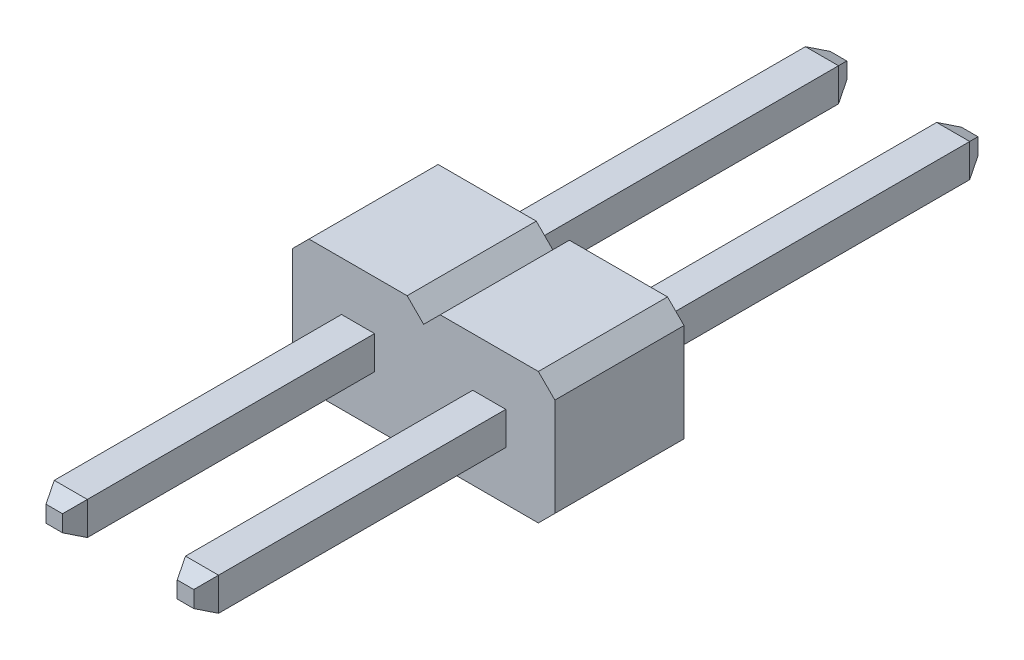
ISO-10303-21;
HEADER;
FILE_DESCRIPTION(('STEP AP214'),'2;1');
FILE_NAME('part.step','',(''),(''),'','','');
FILE_SCHEMA(('AUTOMOTIVE_DESIGN { 1 0 10303 214 1 1 1 1 }'));
ENDSEC;
DATA;
#1=APPLICATION_CONTEXT('core data for automotive mechanical design processes');
#2=APPLICATION_PROTOCOL_DEFINITION('international standard','automotive_design',2000,#1);
#3=PRODUCT_CONTEXT('',#1,'mechanical');
#4=PRODUCT('Part','Part','',(#3));
#5=PRODUCT_RELATED_PRODUCT_CATEGORY('part','',(#4));
#6=PRODUCT_DEFINITION_FORMATION('','',#4);
#7=PRODUCT_DEFINITION_CONTEXT('part definition',#1,'design');
#8=PRODUCT_DEFINITION('design','',#6,#7);
#9=PRODUCT_DEFINITION_SHAPE('','',#8);
#10=(LENGTH_UNIT() NAMED_UNIT(*) SI_UNIT(.MILLI.,.METRE.));
#11=(NAMED_UNIT(*) PLANE_ANGLE_UNIT() SI_UNIT($,.RADIAN.));
#12=(NAMED_UNIT(*) SI_UNIT($,.STERADIAN.) SOLID_ANGLE_UNIT());
#13=UNCERTAINTY_MEASURE_WITH_UNIT(LENGTH_MEASURE(1.E-05),#10,'distance_accuracy_value','');
#14=(GEOMETRIC_REPRESENTATION_CONTEXT(3) GLOBAL_UNCERTAINTY_ASSIGNED_CONTEXT((#13)) GLOBAL_UNIT_ASSIGNED_CONTEXT((#10,
#11,#12)) REPRESENTATION_CONTEXT('',''));
#15=CARTESIAN_POINT('',(0.,0.,0.));
#16=DIRECTION('',(0.,0.,1.));
#17=DIRECTION('',(1.,0.,0.));
#18=AXIS2_PLACEMENT_3D('',#15,#16,#17);
#19=CARTESIAN_POINT('',(0.32,0.,8.06));
#20=DIRECTION('',(-0.894427190999916,0.,-0.447213595499957));
#21=DIRECTION('',(-0.447213595499957,0.,0.894427190999916));
#22=AXIS2_PLACEMENT_3D('',#19,#20,#21);
#23=PLANE('',#22);
#24=DIRECTION('',(-0.408248290463863,-0.408248290463863,0.816496580927727));
#25=VECTOR('',#24,1.);
#26=CARTESIAN_POINT('',(0.266666666666667,0.266666666666667,8.16666666666667));
#27=LINE('',#26,#25);
#28=CARTESIAN_POINT('',(0.32,0.32,8.06));
#29=VERTEX_POINT('',#28);
#30=CARTESIAN_POINT('',(0.16,0.16,8.38));
#31=VERTEX_POINT('',#30);
#32=EDGE_CURVE('P0_E66',#29,#31,#27,.T.);
#33=ORIENTED_EDGE('',*,*,#32,.T.);
#34=DIRECTION('',(0.,1.,0.));
#35=VECTOR('',#34,1.);
#36=CARTESIAN_POINT('',(0.16,0.,8.38));
#37=LINE('',#36,#35);
#38=CARTESIAN_POINT('',(0.16,-0.16,8.38));
#39=VERTEX_POINT('',#38);
#40=EDGE_CURVE('P0_E110',#39,#31,#37,.T.);
#41=ORIENTED_EDGE('',*,*,#40,.F.);
#42=DIRECTION('',(0.408248290463863,-0.408248290463863,-0.816496580927727));
#43=VECTOR('',#42,1.);
#44=CARTESIAN_POINT('',(0.133333333333333,-0.133333333333333,8.43333333333333));
#45=LINE('',#44,#43);
#46=CARTESIAN_POINT('',(0.32,-0.32,8.06));
#47=VERTEX_POINT('',#46);
#48=EDGE_CURVE('P0_E12',#39,#47,#45,.T.);
#49=ORIENTED_EDGE('',*,*,#48,.T.);
#50=DIRECTION('',(0.,-1.,0.));
#51=VECTOR('',#50,1.);
#52=CARTESIAN_POINT('',(0.32,0.,8.06));
#53=LINE('',#52,#51);
#54=EDGE_CURVE('P0_E107',#29,#47,#53,.T.);
#55=ORIENTED_EDGE('',*,*,#54,.F.);
#56=EDGE_LOOP('',(#33,#41,#49,#55));
#57=FACE_BOUND('',#56,.T.);
#58=ADVANCED_FACE('P0_F55',(#57),#23,.F.);
#59=CARTESIAN_POINT('',(0.,-0.16,8.38));
#60=DIRECTION('',(0.,-0.894427190999916,0.447213595499957));
#61=DIRECTION('',(-1.,0.,0.));
#62=AXIS2_PLACEMENT_3D('',#59,#60,#61);
#63=PLANE('',#62);
#64=DIRECTION('',(-0.408248290463863,-0.408248290463863,-0.816496580927727));
#65=VECTOR('',#64,1.);
#66=CARTESIAN_POINT('',(-0.133333333333333,-0.133333333333333,8.43333333333333));
#67=LINE('',#66,#65);
#68=CARTESIAN_POINT('',(-0.16,-0.16,8.38));
#69=VERTEX_POINT('',#68);
#70=CARTESIAN_POINT('',(-0.32,-0.32,8.06));
#71=VERTEX_POINT('',#70);
#72=EDGE_CURVE('P0_E131',#69,#71,#67,.T.);
#73=ORIENTED_EDGE('',*,*,#72,.T.);
#74=DIRECTION('',(-1.,0.,0.));
#75=VECTOR('',#74,1.);
#76=CARTESIAN_POINT('',(-0.32,-0.32,8.06));
#77=LINE('',#76,#75);
#78=EDGE_CURVE('P0_E59',#47,#71,#77,.T.);
#79=ORIENTED_EDGE('',*,*,#78,.F.);
#80=ORIENTED_EDGE('',*,*,#48,.F.);
#81=DIRECTION('',(1.,0.,0.));
#82=VECTOR('',#81,1.);
#83=CARTESIAN_POINT('',(0.32,-0.16,8.38));
#84=LINE('',#83,#82);
#85=EDGE_CURVE('P0_E184',#69,#39,#84,.T.);
#86=ORIENTED_EDGE('',*,*,#85,.F.);
#87=EDGE_LOOP('',(#73,#79,#80,#86));
#88=FACE_BOUND('',#87,.T.);
#89=ADVANCED_FACE('P0_F130',(#88),#63,.T.);
#90=CARTESIAN_POINT('',(0.,0.32,8.06));
#91=DIRECTION('',(0.,-0.894427190999916,-0.447213595499957));
#92=DIRECTION('',(0.,0.447213595499957,-0.894427190999916));
#93=AXIS2_PLACEMENT_3D('',#90,#91,#92);
#94=PLANE('',#93);
#95=DIRECTION('',(0.408248290463863,-0.408248290463863,0.816496580927727));
#96=VECTOR('',#95,1.);
#97=CARTESIAN_POINT('',(-0.266666666666667,0.266666666666667,8.16666666666667));
#98=LINE('',#97,#96);
#99=CARTESIAN_POINT('',(-0.32,0.32,8.06));
#100=VERTEX_POINT('',#99);
#101=CARTESIAN_POINT('',(-0.16,0.16,8.38));
#102=VERTEX_POINT('',#101);
#103=EDGE_CURVE('P0_E102',#100,#102,#98,.T.);
#104=ORIENTED_EDGE('',*,*,#103,.T.);
#105=DIRECTION('',(-1.,0.,0.));
#106=VECTOR('',#105,1.);
#107=CARTESIAN_POINT('',(0.,0.16,8.38));
#108=LINE('',#107,#106);
#109=EDGE_CURVE('P0_E176',#31,#102,#108,.T.);
#110=ORIENTED_EDGE('',*,*,#109,.F.);
#111=ORIENTED_EDGE('',*,*,#32,.F.);
#112=DIRECTION('',(1.,0.,0.));
#113=VECTOR('',#112,1.);
#114=CARTESIAN_POINT('',(0.,0.32,8.06));
#115=LINE('',#114,#113);
#116=EDGE_CURVE('P0_E152',#100,#29,#115,.T.);
#117=ORIENTED_EDGE('',*,*,#116,.F.);
#118=EDGE_LOOP('',(#104,#110,#111,#117));
#119=FACE_BOUND('',#118,.T.);
#120=ADVANCED_FACE('P0_F291',(#119),#94,.F.);
#121=CARTESIAN_POINT('',(-0.16,0.,8.38));
#122=DIRECTION('',(-0.894427190999916,0.,0.447213595499957));
#123=DIRECTION('',(0.,1.,0.));
#124=AXIS2_PLACEMENT_3D('',#121,#122,#123);
#125=PLANE('',#124);
#126=ORIENTED_EDGE('',*,*,#72,.F.);
#127=DIRECTION('',(0.,-1.,0.));
#128=VECTOR('',#127,1.);
#129=CARTESIAN_POINT('',(-0.16,-0.32,8.38));
#130=LINE('',#129,#128);
#131=EDGE_CURVE('P0_E127',#102,#69,#130,.T.);
#132=ORIENTED_EDGE('',*,*,#131,.F.);
#133=ORIENTED_EDGE('',*,*,#103,.F.);
#134=DIRECTION('',(0.,1.,0.));
#135=VECTOR('',#134,1.);
#136=CARTESIAN_POINT('',(-0.32,0.32,8.06));
#137=LINE('',#136,#135);
#138=EDGE_CURVE('P0_E141',#71,#100,#137,.T.);
#139=ORIENTED_EDGE('',*,*,#138,.F.);
#140=EDGE_LOOP('',(#126,#132,#133,#139));
#141=FACE_BOUND('',#140,.T.);
#142=ADVANCED_FACE('P0_F293',(#141),#125,.T.);
#143=CARTESIAN_POINT('',(0.,0.,8.38));
#144=DIRECTION('',(0.,0.,1.));
#145=DIRECTION('',(1.,0.,0.));
#146=AXIS2_PLACEMENT_3D('',#143,#144,#145);
#147=PLANE('',#146);
#148=ORIENTED_EDGE('',*,*,#131,.T.);
#149=ORIENTED_EDGE('',*,*,#85,.T.);
#150=ORIENTED_EDGE('',*,*,#40,.T.);
#151=ORIENTED_EDGE('',*,*,#109,.T.);
#152=EDGE_LOOP('',(#148,#149,#150,#151));
#153=FACE_BOUND('',#152,.T.);
#154=ADVANCED_FACE('P0_F299',(#153),#147,.T.);
#155=CARTESIAN_POINT('',(0.32,0.,8.38));
#156=DIRECTION('',(1.,0.,0.));
#157=DIRECTION('',(0.,1.,0.));
#158=AXIS2_PLACEMENT_3D('',#155,#156,#157);
#159=PLANE('',#158);
#160=DIRECTION('',(0.,0.,-1.));
#161=VECTOR('',#160,1.);
#162=CARTESIAN_POINT('',(0.32,0.32,8.38));
#163=LINE('',#162,#161);
#164=CARTESIAN_POINT('',(0.32,0.32,-6.48));
#165=VERTEX_POINT('',#164);
#166=EDGE_CURVE('P0_E124',#29,#165,#163,.T.);
#167=ORIENTED_EDGE('',*,*,#166,.F.);
#168=ORIENTED_EDGE('',*,*,#54,.T.);
#169=DIRECTION('',(0.,0.,-1.));
#170=VECTOR('',#169,1.);
#171=CARTESIAN_POINT('',(0.32,-0.32,8.38));
#172=LINE('',#171,#170);
#173=CARTESIAN_POINT('',(0.32,-0.32,-6.48));
#174=VERTEX_POINT('',#173);
#175=EDGE_CURVE('P0_E121',#47,#174,#172,.T.);
#176=ORIENTED_EDGE('',*,*,#175,.T.);
#177=DIRECTION('',(0.,1.,0.));
#178=VECTOR('',#177,1.);
#179=CARTESIAN_POINT('',(0.32,0.,-6.48));
#180=LINE('',#179,#178);
#181=EDGE_CURVE('P0_E211',#174,#165,#180,.T.);
#182=ORIENTED_EDGE('',*,*,#181,.T.);
#183=EDGE_LOOP('',(#167,#168,#176,#182));
#184=FACE_BOUND('',#183,.T.);
#185=ADVANCED_FACE('P0_F117',(#184),#159,.T.);
#186=CARTESIAN_POINT('',(0.,-0.32,8.38));
#187=DIRECTION('',(0.,1.,0.));
#188=DIRECTION('',(1.,0.,0.));
#189=AXIS2_PLACEMENT_3D('',#186,#187,#188);
#190=PLANE('',#189);
#191=ORIENTED_EDGE('',*,*,#175,.F.);
#192=ORIENTED_EDGE('',*,*,#78,.T.);
#193=DIRECTION('',(0.,0.,-1.));
#194=VECTOR('',#193,1.);
#195=CARTESIAN_POINT('',(-0.32,-0.32,8.38));
#196=LINE('',#195,#194);
#197=CARTESIAN_POINT('',(-0.32,-0.32,-6.48));
#198=VERTEX_POINT('',#197);
#199=EDGE_CURVE('P0_E148',#71,#198,#196,.T.);
#200=ORIENTED_EDGE('',*,*,#199,.T.);
#201=DIRECTION('',(1.,0.,0.));
#202=VECTOR('',#201,1.);
#203=CARTESIAN_POINT('',(0.32,-0.32,-6.48));
#204=LINE('',#203,#202);
#205=EDGE_CURVE('P0_E139',#198,#174,#204,.T.);
#206=ORIENTED_EDGE('',*,*,#205,.T.);
#207=EDGE_LOOP('',(#191,#192,#200,#206));
#208=FACE_BOUND('',#207,.T.);
#209=ADVANCED_FACE('P0_F137',(#208),#190,.F.);
#210=CARTESIAN_POINT('',(-0.32,0.,8.38));
#211=DIRECTION('',(1.,0.,0.));
#212=DIRECTION('',(0.,1.,0.));
#213=AXIS2_PLACEMENT_3D('',#210,#211,#212);
#214=PLANE('',#213);
#215=ORIENTED_EDGE('',*,*,#199,.F.);
#216=ORIENTED_EDGE('',*,*,#138,.T.);
#217=DIRECTION('',(0.,0.,-1.));
#218=VECTOR('',#217,1.);
#219=CARTESIAN_POINT('',(-0.32,0.32,8.38));
#220=LINE('',#219,#218);
#221=CARTESIAN_POINT('',(-0.32,0.32,-6.48));
#222=VERTEX_POINT('',#221);
#223=EDGE_CURVE('P0_E162',#100,#222,#220,.T.);
#224=ORIENTED_EDGE('',*,*,#223,.T.);
#225=DIRECTION('',(0.,-1.,0.));
#226=VECTOR('',#225,1.);
#227=CARTESIAN_POINT('',(-0.32,-0.32,-6.48));
#228=LINE('',#227,#226);
#229=EDGE_CURVE('P0_E197',#222,#198,#228,.T.);
#230=ORIENTED_EDGE('',*,*,#229,.T.);
#231=EDGE_LOOP('',(#215,#216,#224,#230));
#232=FACE_BOUND('',#231,.T.);
#233=ADVANCED_FACE('P0_F290',(#232),#214,.F.);
#234=CARTESIAN_POINT('',(0.,0.32,8.38));
#235=DIRECTION('',(0.,1.,0.));
#236=DIRECTION('',(1.,0.,0.));
#237=AXIS2_PLACEMENT_3D('',#234,#235,#236);
#238=PLANE('',#237);
#239=ORIENTED_EDGE('',*,*,#223,.F.);
#240=ORIENTED_EDGE('',*,*,#116,.T.);
#241=ORIENTED_EDGE('',*,*,#166,.T.);
#242=DIRECTION('',(-1.,0.,0.));
#243=VECTOR('',#242,1.);
#244=CARTESIAN_POINT('',(0.,0.32,-6.48));
#245=LINE('',#244,#243);
#246=EDGE_CURVE('P0_E201',#165,#222,#245,.T.);
#247=ORIENTED_EDGE('',*,*,#246,.T.);
#248=EDGE_LOOP('',(#239,#240,#241,#247));
#249=FACE_BOUND('',#248,.T.);
#250=ADVANCED_FACE('P0_F57',(#249),#238,.T.);
#251=CARTESIAN_POINT('',(0.16,0.,-6.8));
#252=DIRECTION('',(-0.894427190999916,0.,0.447213595499958));
#253=DIRECTION('',(0.,1.,0.));
#254=AXIS2_PLACEMENT_3D('',#251,#252,#253);
#255=PLANE('',#254);
#256=DIRECTION('',(0.408248290463863,0.408248290463863,0.816496580927726));
#257=VECTOR('',#256,1.);
#258=CARTESIAN_POINT('',(0.133333333333333,0.133333333333333,-6.85333333333333));
#259=LINE('',#258,#257);
#260=CARTESIAN_POINT('',(0.16,0.16,-6.8));
#261=VERTEX_POINT('',#260);
#262=EDGE_CURVE('P0_E217',#261,#165,#259,.T.);
#263=ORIENTED_EDGE('',*,*,#262,.T.);
#264=ORIENTED_EDGE('',*,*,#181,.F.);
#265=DIRECTION('',(-0.408248290463863,0.408248290463863,-0.816496580927726));
#266=VECTOR('',#265,1.);
#267=CARTESIAN_POINT('',(0.266666666666666,-0.266666666666666,-6.58666666666667));
#268=LINE('',#267,#266);
#269=CARTESIAN_POINT('',(0.16,-0.16,-6.8));
#270=VERTEX_POINT('',#269);
#271=EDGE_CURVE('P0_E169',#174,#270,#268,.T.);
#272=ORIENTED_EDGE('',*,*,#271,.T.);
#273=DIRECTION('',(0.,-1.,0.));
#274=VECTOR('',#273,1.);
#275=CARTESIAN_POINT('',(0.16,0.,-6.8));
#276=LINE('',#275,#274);
#277=EDGE_CURVE('P0_E196',#261,#270,#276,.T.);
#278=ORIENTED_EDGE('',*,*,#277,.F.);
#279=EDGE_LOOP('',(#263,#264,#272,#278));
#280=FACE_BOUND('',#279,.T.);
#281=ADVANCED_FACE('P0_F283',(#280),#255,.F.);
#282=CARTESIAN_POINT('',(0.,-0.32,-6.48));
#283=DIRECTION('',(0.,-0.894427190999916,-0.447213595499958));
#284=DIRECTION('',(0.,0.447213595499958,-0.894427190999916));
#285=AXIS2_PLACEMENT_3D('',#282,#283,#284);
#286=PLANE('',#285);
#287=DIRECTION('',(0.408248290463863,0.408248290463863,-0.816496580927726));
#288=VECTOR('',#287,1.);
#289=CARTESIAN_POINT('',(-0.266666666666666,-0.266666666666666,-6.58666666666667));
#290=LINE('',#289,#288);
#291=CARTESIAN_POINT('',(-0.16,-0.16,-6.8));
#292=VERTEX_POINT('',#291);
#293=EDGE_CURVE('P0_E202',#198,#292,#290,.T.);
#294=ORIENTED_EDGE('',*,*,#293,.T.);
#295=DIRECTION('',(-1.,0.,0.));
#296=VECTOR('',#295,1.);
#297=CARTESIAN_POINT('',(-0.32,-0.16,-6.8));
#298=LINE('',#297,#296);
#299=EDGE_CURVE('P0_E191',#270,#292,#298,.T.);
#300=ORIENTED_EDGE('',*,*,#299,.F.);
#301=ORIENTED_EDGE('',*,*,#271,.F.);
#302=ORIENTED_EDGE('',*,*,#205,.F.);
#303=EDGE_LOOP('',(#294,#300,#301,#302));
#304=FACE_BOUND('',#303,.T.);
#305=ADVANCED_FACE('P0_F285',(#304),#286,.T.);
#306=CARTESIAN_POINT('',(0.,0.16,-6.8));
#307=DIRECTION('',(0.,-0.894427190999916,0.447213595499958));
#308=DIRECTION('',(-1.,0.,0.));
#309=AXIS2_PLACEMENT_3D('',#306,#307,#308);
#310=PLANE('',#309);
#311=DIRECTION('',(-0.408248290463863,0.408248290463863,0.816496580927726));
#312=VECTOR('',#311,1.);
#313=CARTESIAN_POINT('',(-0.133333333333333,0.133333333333333,-6.85333333333333));
#314=LINE('',#313,#312);
#315=CARTESIAN_POINT('',(-0.16,0.16,-6.8));
#316=VERTEX_POINT('',#315);
#317=EDGE_CURVE('P0_E206',#316,#222,#314,.T.);
#318=ORIENTED_EDGE('',*,*,#317,.T.);
#319=ORIENTED_EDGE('',*,*,#246,.F.);
#320=ORIENTED_EDGE('',*,*,#262,.F.);
#321=DIRECTION('',(1.,0.,0.));
#322=VECTOR('',#321,1.);
#323=CARTESIAN_POINT('',(0.,0.16,-6.8));
#324=LINE('',#323,#322);
#325=EDGE_CURVE('P0_E207',#316,#261,#324,.T.);
#326=ORIENTED_EDGE('',*,*,#325,.F.);
#327=EDGE_LOOP('',(#318,#319,#320,#326));
#328=FACE_BOUND('',#327,.T.);
#329=ADVANCED_FACE('P0_F241',(#328),#310,.F.);
#330=CARTESIAN_POINT('',(-0.32,0.,-6.48));
#331=DIRECTION('',(-0.894427190999916,0.,-0.447213595499958));
#332=DIRECTION('',(-0.447213595499958,0.,0.894427190999916));
#333=AXIS2_PLACEMENT_3D('',#330,#331,#332);
#334=PLANE('',#333);
#335=ORIENTED_EDGE('',*,*,#293,.F.);
#336=ORIENTED_EDGE('',*,*,#229,.F.);
#337=ORIENTED_EDGE('',*,*,#317,.F.);
#338=DIRECTION('',(0.,1.,0.));
#339=VECTOR('',#338,1.);
#340=CARTESIAN_POINT('',(-0.16,0.32,-6.8));
#341=LINE('',#340,#339);
#342=EDGE_CURVE('P0_E195',#292,#316,#341,.T.);
#343=ORIENTED_EDGE('',*,*,#342,.F.);
#344=EDGE_LOOP('',(#335,#336,#337,#343));
#345=FACE_BOUND('',#344,.T.);
#346=ADVANCED_FACE('P0_F288',(#345),#334,.T.);
#347=CARTESIAN_POINT('',(0.,0.,-6.8));
#348=DIRECTION('',(0.,0.,1.));
#349=DIRECTION('',(1.,0.,0.));
#350=AXIS2_PLACEMENT_3D('',#347,#348,#349);
#351=PLANE('',#350);
#352=ORIENTED_EDGE('',*,*,#277,.T.);
#353=ORIENTED_EDGE('',*,*,#299,.T.);
#354=ORIENTED_EDGE('',*,*,#342,.T.);
#355=ORIENTED_EDGE('',*,*,#325,.T.);
#356=EDGE_LOOP('',(#352,#353,#354,#355));
#357=FACE_BOUND('',#356,.T.);
#358=ADVANCED_FACE('P0_F287',(#357),#351,.F.);
#359=CLOSED_SHELL('',(#58,#89,#120,#142,#154,#185,#209,#233,#250,#281,#305,#329,#346,#358));
#360=MANIFOLD_SOLID_BREP('P0_B2',#359);
#361=CARTESIAN_POINT('',(2.86,0.,8.06));
#362=DIRECTION('',(-0.894427190999916,0.,-0.447213595499957));
#363=DIRECTION('',(-0.447213595499957,0.,0.894427190999916));
#364=AXIS2_PLACEMENT_3D('',#361,#362,#363);
#365=PLANE('',#364);
#366=DIRECTION('',(-0.408248290463863,-0.408248290463863,0.816496580927727));
#367=VECTOR('',#366,1.);
#368=CARTESIAN_POINT('',(2.80666666666667,0.266666666666667,8.16666666666667));
#369=LINE('',#368,#367);
#370=CARTESIAN_POINT('',(2.86,0.32,8.06));
#371=VERTEX_POINT('',#370);
#372=CARTESIAN_POINT('',(2.7,0.16,8.38));
#373=VERTEX_POINT('',#372);
#374=EDGE_CURVE('P0_E569',#371,#373,#369,.T.);
#375=ORIENTED_EDGE('',*,*,#374,.T.);
#376=DIRECTION('',(0.,1.,0.));
#377=VECTOR('',#376,1.);
#378=CARTESIAN_POINT('',(2.7,0.,8.38));
#379=LINE('',#378,#377);
#380=CARTESIAN_POINT('',(2.7,-0.16,8.38));
#381=VERTEX_POINT('',#380);
#382=EDGE_CURVE('P0_E653',#381,#373,#379,.T.);
#383=ORIENTED_EDGE('',*,*,#382,.F.);
#384=DIRECTION('',(0.408248290463863,-0.408248290463863,-0.816496580927727));
#385=VECTOR('',#384,1.);
#386=CARTESIAN_POINT('',(2.67333333333333,-0.133333333333333,8.43333333333333));
#387=LINE('',#386,#385);
#388=CARTESIAN_POINT('',(2.86,-0.32,8.06));
#389=VERTEX_POINT('',#388);
#390=EDGE_CURVE('P0_E53',#381,#389,#387,.T.);
#391=ORIENTED_EDGE('',*,*,#390,.T.);
#392=DIRECTION('',(0.,-1.,0.));
#393=VECTOR('',#392,1.);
#394=CARTESIAN_POINT('',(2.86,0.,8.06));
#395=LINE('',#394,#393);
#396=EDGE_CURVE('P0_E650',#371,#389,#395,.T.);
#397=ORIENTED_EDGE('',*,*,#396,.F.);
#398=EDGE_LOOP('',(#375,#383,#391,#397));
#399=FACE_BOUND('',#398,.T.);
#400=ADVANCED_FACE('P0_F559',(#399),#365,.F.);
#401=CARTESIAN_POINT('',(2.54,-0.16,8.38));
#402=DIRECTION('',(0.,-0.894427190999916,0.447213595499957));
#403=DIRECTION('',(-1.,0.,0.));
#404=AXIS2_PLACEMENT_3D('',#401,#402,#403);
#405=PLANE('',#404);
#406=DIRECTION('',(-0.408248290463863,-0.408248290463863,-0.816496580927727));
#407=VECTOR('',#406,1.);
#408=CARTESIAN_POINT('',(2.40666666666667,-0.133333333333333,8.43333333333333));
#409=LINE('',#408,#407);
#410=CARTESIAN_POINT('',(2.38,-0.16,8.38));
#411=VERTEX_POINT('',#410);
#412=CARTESIAN_POINT('',(2.22,-0.32,8.06));
#413=VERTEX_POINT('',#412);
#414=EDGE_CURVE('P0_E668',#411,#413,#409,.T.);
#415=ORIENTED_EDGE('',*,*,#414,.T.);
#416=DIRECTION('',(-1.,0.,0.));
#417=VECTOR('',#416,1.);
#418=CARTESIAN_POINT('',(2.22,-0.32,8.06));
#419=LINE('',#418,#417);
#420=EDGE_CURVE('P0_E665',#389,#413,#419,.T.);
#421=ORIENTED_EDGE('',*,*,#420,.F.);
#422=ORIENTED_EDGE('',*,*,#390,.F.);
#423=DIRECTION('',(1.,0.,0.));
#424=VECTOR('',#423,1.);
#425=CARTESIAN_POINT('',(2.86,-0.16,8.38));
#426=LINE('',#425,#424);
#427=EDGE_CURVE('P0_E734',#411,#381,#426,.T.);
#428=ORIENTED_EDGE('',*,*,#427,.F.);
#429=EDGE_LOOP('',(#415,#421,#422,#428));
#430=FACE_BOUND('',#429,.T.);
#431=ADVANCED_FACE('P0_F667',(#430),#405,.T.);
#432=CARTESIAN_POINT('',(2.54,0.32,8.06));
#433=DIRECTION('',(0.,-0.894427190999916,-0.447213595499957));
#434=DIRECTION('',(0.,0.447213595499957,-0.894427190999916));
#435=AXIS2_PLACEMENT_3D('',#432,#433,#434);
#436=PLANE('',#435);
#437=DIRECTION('',(0.408248290463863,-0.408248290463863,0.816496580927727));
#438=VECTOR('',#437,1.);
#439=CARTESIAN_POINT('',(2.27333333333334,0.266666666666667,8.16666666666667));
#440=LINE('',#439,#438);
#441=CARTESIAN_POINT('',(2.22,0.32,8.06));
#442=VERTEX_POINT('',#441);
#443=CARTESIAN_POINT('',(2.38,0.16,8.38));
#444=VERTEX_POINT('',#443);
#445=EDGE_CURVE('P0_E609',#442,#444,#440,.T.);
#446=ORIENTED_EDGE('',*,*,#445,.T.);
#447=DIRECTION('',(-1.,0.,0.));
#448=VECTOR('',#447,1.);
#449=CARTESIAN_POINT('',(2.54,0.16,8.38));
#450=LINE('',#449,#448);
#451=EDGE_CURVE('P0_E690',#373,#444,#450,.T.);
#452=ORIENTED_EDGE('',*,*,#451,.F.);
#453=ORIENTED_EDGE('',*,*,#374,.F.);
#454=DIRECTION('',(1.,0.,0.));
#455=VECTOR('',#454,1.);
#456=CARTESIAN_POINT('',(2.54,0.32,8.06));
#457=LINE('',#456,#455);
#458=EDGE_CURVE('P0_E696',#442,#371,#457,.T.);
#459=ORIENTED_EDGE('',*,*,#458,.F.);
#460=EDGE_LOOP('',(#446,#452,#453,#459));
#461=FACE_BOUND('',#460,.T.);
#462=ADVANCED_FACE('P0_F868',(#461),#436,.F.);
#463=CARTESIAN_POINT('',(2.38,0.,8.38));
#464=DIRECTION('',(-0.894427190999916,0.,0.447213595499957));
#465=DIRECTION('',(0.,1.,0.));
#466=AXIS2_PLACEMENT_3D('',#463,#464,#465);
#467=PLANE('',#466);
#468=ORIENTED_EDGE('',*,*,#414,.F.);
#469=DIRECTION('',(0.,-1.,0.));
#470=VECTOR('',#469,1.);
#471=CARTESIAN_POINT('',(2.38,-0.32,8.38));
#472=LINE('',#471,#470);
#473=EDGE_CURVE('P0_E664',#444,#411,#472,.T.);
#474=ORIENTED_EDGE('',*,*,#473,.F.);
#475=ORIENTED_EDGE('',*,*,#445,.F.);
#476=DIRECTION('',(0.,1.,0.));
#477=VECTOR('',#476,1.);
#478=CARTESIAN_POINT('',(2.22,0.32,8.06));
#479=LINE('',#478,#477);
#480=EDGE_CURVE('P0_E677',#413,#442,#479,.T.);
#481=ORIENTED_EDGE('',*,*,#480,.F.);
#482=EDGE_LOOP('',(#468,#474,#475,#481));
#483=FACE_BOUND('',#482,.T.);
#484=ADVANCED_FACE('P0_F744',(#483),#467,.T.);
#485=CARTESIAN_POINT('',(2.54,0.,8.38));
#486=DIRECTION('',(0.,0.,1.));
#487=DIRECTION('',(1.,0.,0.));
#488=AXIS2_PLACEMENT_3D('',#485,#486,#487);
#489=PLANE('',#488);
#490=ORIENTED_EDGE('',*,*,#473,.T.);
#491=ORIENTED_EDGE('',*,*,#427,.T.);
#492=ORIENTED_EDGE('',*,*,#382,.T.);
#493=ORIENTED_EDGE('',*,*,#451,.T.);
#494=EDGE_LOOP('',(#490,#491,#492,#493));
#495=FACE_BOUND('',#494,.T.);
#496=ADVANCED_FACE('P0_F561',(#495),#489,.T.);
#497=CARTESIAN_POINT('',(2.86,0.,8.38));
#498=DIRECTION('',(1.,0.,0.));
#499=DIRECTION('',(0.,1.,0.));
#500=AXIS2_PLACEMENT_3D('',#497,#498,#499);
#501=PLANE('',#500);
#502=DIRECTION('',(0.,0.,-1.));
#503=VECTOR('',#502,1.);
#504=CARTESIAN_POINT('',(2.86,0.32,8.38));
#505=LINE('',#504,#503);
#506=CARTESIAN_POINT('',(2.86,0.32,-6.48));
#507=VERTEX_POINT('',#506);
#508=EDGE_CURVE('P0_E661',#371,#507,#505,.T.);
#509=ORIENTED_EDGE('',*,*,#508,.F.);
#510=ORIENTED_EDGE('',*,*,#396,.T.);
#511=DIRECTION('',(0.,0.,-1.));
#512=VECTOR('',#511,1.);
#513=CARTESIAN_POINT('',(2.86,-0.32,8.38));
#514=LINE('',#513,#512);
#515=CARTESIAN_POINT('',(2.86,-0.32,-6.48));
#516=VERTEX_POINT('',#515);
#517=EDGE_CURVE('P0_E659',#389,#516,#514,.T.);
#518=ORIENTED_EDGE('',*,*,#517,.T.);
#519=DIRECTION('',(0.,1.,0.));
#520=VECTOR('',#519,1.);
#521=CARTESIAN_POINT('',(2.86,0.,-6.48));
#522=LINE('',#521,#520);
#523=EDGE_CURVE('P0_E767',#516,#507,#522,.T.);
#524=ORIENTED_EDGE('',*,*,#523,.T.);
#525=EDGE_LOOP('',(#509,#510,#518,#524));
#526=FACE_BOUND('',#525,.T.);
#527=ADVANCED_FACE('P0_F656',(#526),#501,.T.);
#528=CARTESIAN_POINT('',(2.54,-0.32,8.38));
#529=DIRECTION('',(0.,1.,0.));
#530=DIRECTION('',(1.,0.,0.));
#531=AXIS2_PLACEMENT_3D('',#528,#529,#530);
#532=PLANE('',#531);
#533=ORIENTED_EDGE('',*,*,#517,.F.);
#534=ORIENTED_EDGE('',*,*,#420,.T.);
#535=DIRECTION('',(0.,0.,-1.));
#536=VECTOR('',#535,1.);
#537=CARTESIAN_POINT('',(2.22,-0.32,8.38));
#538=LINE('',#537,#536);
#539=CARTESIAN_POINT('',(2.22,-0.32,-6.48));
#540=VERTEX_POINT('',#539);
#541=EDGE_CURVE('P0_E563',#413,#540,#538,.T.);
#542=ORIENTED_EDGE('',*,*,#541,.T.);
#543=DIRECTION('',(1.,0.,0.));
#544=VECTOR('',#543,1.);
#545=CARTESIAN_POINT('',(2.86,-0.32,-6.48));
#546=LINE('',#545,#544);
#547=EDGE_CURVE('P0_E675',#540,#516,#546,.T.);
#548=ORIENTED_EDGE('',*,*,#547,.T.);
#549=EDGE_LOOP('',(#533,#534,#542,#548));
#550=FACE_BOUND('',#549,.T.);
#551=ADVANCED_FACE('P0_F673',(#550),#532,.F.);
#552=CARTESIAN_POINT('',(2.22,0.,8.38));
#553=DIRECTION('',(1.,0.,0.));
#554=DIRECTION('',(0.,1.,0.));
#555=AXIS2_PLACEMENT_3D('',#552,#553,#554);
#556=PLANE('',#555);
#557=ORIENTED_EDGE('',*,*,#541,.F.);
#558=ORIENTED_EDGE('',*,*,#480,.T.);
#559=DIRECTION('',(0.,0.,-1.));
#560=VECTOR('',#559,1.);
#561=CARTESIAN_POINT('',(2.22,0.32,8.38));
#562=LINE('',#561,#560);
#563=CARTESIAN_POINT('',(2.22,0.32,-6.48));
#564=VERTEX_POINT('',#563);
#565=EDGE_CURVE('P0_E698',#442,#564,#562,.T.);
#566=ORIENTED_EDGE('',*,*,#565,.T.);
#567=DIRECTION('',(0.,-1.,0.));
#568=VECTOR('',#567,1.);
#569=CARTESIAN_POINT('',(2.22,-0.32,-6.48));
#570=LINE('',#569,#568);
#571=EDGE_CURVE('P0_E748',#564,#540,#570,.T.);
#572=ORIENTED_EDGE('',*,*,#571,.T.);
#573=EDGE_LOOP('',(#557,#558,#566,#572));
#574=FACE_BOUND('',#573,.T.);
#575=ADVANCED_FACE('P0_F747',(#574),#556,.F.);
#576=CARTESIAN_POINT('',(2.54,0.32,8.38));
#577=DIRECTION('',(0.,1.,0.));
#578=DIRECTION('',(1.,0.,0.));
#579=AXIS2_PLACEMENT_3D('',#576,#577,#578);
#580=PLANE('',#579);
#581=ORIENTED_EDGE('',*,*,#565,.F.);
#582=ORIENTED_EDGE('',*,*,#458,.T.);
#583=ORIENTED_EDGE('',*,*,#508,.T.);
#584=DIRECTION('',(-1.,0.,0.));
#585=VECTOR('',#584,1.);
#586=CARTESIAN_POINT('',(2.54,0.32,-6.48));
#587=LINE('',#586,#585);
#588=EDGE_CURVE('P0_E726',#507,#564,#587,.T.);
#589=ORIENTED_EDGE('',*,*,#588,.T.);
#590=EDGE_LOOP('',(#581,#582,#583,#589));
#591=FACE_BOUND('',#590,.T.);
#592=ADVANCED_FACE('P0_F845',(#591),#580,.T.);
#593=CARTESIAN_POINT('',(2.7,0.,-6.8));
#594=DIRECTION('',(-0.894427190999916,0.,0.447213595499958));
#595=DIRECTION('',(0.,1.,0.));
#596=AXIS2_PLACEMENT_3D('',#593,#594,#595);
#597=PLANE('',#596);
#598=DIRECTION('',(0.408248290463863,0.408248290463863,0.816496580927726));
#599=VECTOR('',#598,1.);
#600=CARTESIAN_POINT('',(2.67333333333333,0.133333333333333,-6.85333333333333));
#601=LINE('',#600,#599);
#602=CARTESIAN_POINT('',(2.7,0.16,-6.8));
#603=VERTEX_POINT('',#602);
#604=EDGE_CURVE('P0_E713',#603,#507,#601,.T.);
#605=ORIENTED_EDGE('',*,*,#604,.T.);
#606=ORIENTED_EDGE('',*,*,#523,.F.);
#607=DIRECTION('',(-0.408248290463863,0.408248290463863,-0.816496580927726));
#608=VECTOR('',#607,1.);
#609=CARTESIAN_POINT('',(2.80666666666667,-0.266666666666666,-6.58666666666667));
#610=LINE('',#609,#608);
#611=CARTESIAN_POINT('',(2.7,-0.16,-6.8));
#612=VERTEX_POINT('',#611);
#613=EDGE_CURVE('P0_E704',#516,#612,#610,.T.);
#614=ORIENTED_EDGE('',*,*,#613,.T.);
#615=DIRECTION('',(0.,-1.,0.));
#616=VECTOR('',#615,1.);
#617=CARTESIAN_POINT('',(2.7,0.,-6.8));
#618=LINE('',#617,#616);
#619=EDGE_CURVE('P0_E771',#603,#612,#618,.T.);
#620=ORIENTED_EDGE('',*,*,#619,.F.);
#621=EDGE_LOOP('',(#605,#606,#614,#620));
#622=FACE_BOUND('',#621,.T.);
#623=ADVANCED_FACE('P0_F850',(#622),#597,.F.);
#624=CARTESIAN_POINT('',(2.54,-0.32,-6.48));
#625=DIRECTION('',(0.,-0.894427190999916,-0.447213595499958));
#626=DIRECTION('',(0.,0.447213595499958,-0.894427190999916));
#627=AXIS2_PLACEMENT_3D('',#624,#625,#626);
#628=PLANE('',#627);
#629=DIRECTION('',(0.408248290463863,0.408248290463863,-0.816496580927726));
#630=VECTOR('',#629,1.);
#631=CARTESIAN_POINT('',(2.27333333333334,-0.266666666666666,-6.58666666666667));
#632=LINE('',#631,#630);
#633=CARTESIAN_POINT('',(2.38,-0.16,-6.8));
#634=VERTEX_POINT('',#633);
#635=EDGE_CURVE('P0_E731',#540,#634,#632,.T.);
#636=ORIENTED_EDGE('',*,*,#635,.T.);
#637=DIRECTION('',(-1.,0.,0.));
#638=VECTOR('',#637,1.);
#639=CARTESIAN_POINT('',(2.22,-0.16,-6.8));
#640=LINE('',#639,#638);
#641=EDGE_CURVE('P0_E780',#612,#634,#640,.T.);
#642=ORIENTED_EDGE('',*,*,#641,.F.);
#643=ORIENTED_EDGE('',*,*,#613,.F.);
#644=ORIENTED_EDGE('',*,*,#547,.F.);
#645=EDGE_LOOP('',(#636,#642,#643,#644));
#646=FACE_BOUND('',#645,.T.);
#647=ADVANCED_FACE('P0_F918',(#646),#628,.T.);
#648=CARTESIAN_POINT('',(2.54,0.16,-6.8));
#649=DIRECTION('',(0.,-0.894427190999916,0.447213595499958));
#650=DIRECTION('',(-1.,0.,0.));
#651=AXIS2_PLACEMENT_3D('',#648,#649,#650);
#652=PLANE('',#651);
#653=DIRECTION('',(-0.408248290463863,0.408248290463863,0.816496580927726));
#654=VECTOR('',#653,1.);
#655=CARTESIAN_POINT('',(2.40666666666667,0.133333333333333,-6.85333333333333));
#656=LINE('',#655,#654);
#657=CARTESIAN_POINT('',(2.38,0.16,-6.8));
#658=VERTEX_POINT('',#657);
#659=EDGE_CURVE('P0_E623',#658,#564,#656,.T.);
#660=ORIENTED_EDGE('',*,*,#659,.T.);
#661=ORIENTED_EDGE('',*,*,#588,.F.);
#662=ORIENTED_EDGE('',*,*,#604,.F.);
#663=DIRECTION('',(1.,0.,0.));
#664=VECTOR('',#663,1.);
#665=CARTESIAN_POINT('',(2.54,0.16,-6.8));
#666=LINE('',#665,#664);
#667=EDGE_CURVE('P0_E728',#658,#603,#666,.T.);
#668=ORIENTED_EDGE('',*,*,#667,.F.);
#669=EDGE_LOOP('',(#660,#661,#662,#668));
#670=FACE_BOUND('',#669,.T.);
#671=ADVANCED_FACE('P0_F928',(#670),#652,.F.);
#672=CARTESIAN_POINT('',(2.22,0.,-6.48));
#673=DIRECTION('',(-0.894427190999916,0.,-0.447213595499958));
#674=DIRECTION('',(-0.447213595499958,0.,0.894427190999916));
#675=AXIS2_PLACEMENT_3D('',#672,#673,#674);
#676=PLANE('',#675);
#677=ORIENTED_EDGE('',*,*,#635,.F.);
#678=ORIENTED_EDGE('',*,*,#571,.F.);
#679=ORIENTED_EDGE('',*,*,#659,.F.);
#680=DIRECTION('',(0.,1.,0.));
#681=VECTOR('',#680,1.);
#682=CARTESIAN_POINT('',(2.38,0.32,-6.8));
#683=LINE('',#682,#681);
#684=EDGE_CURVE('P0_E732',#634,#658,#683,.T.);
#685=ORIENTED_EDGE('',*,*,#684,.F.);
#686=EDGE_LOOP('',(#677,#678,#679,#685));
#687=FACE_BOUND('',#686,.T.);
#688=ADVANCED_FACE('P0_F939',(#687),#676,.T.);
#689=CARTESIAN_POINT('',(2.54,0.,-6.8));
#690=DIRECTION('',(0.,0.,1.));
#691=DIRECTION('',(1.,0.,0.));
#692=AXIS2_PLACEMENT_3D('',#689,#690,#691);
#693=PLANE('',#692);
#694=ORIENTED_EDGE('',*,*,#619,.T.);
#695=ORIENTED_EDGE('',*,*,#641,.T.);
#696=ORIENTED_EDGE('',*,*,#684,.T.);
#697=ORIENTED_EDGE('',*,*,#667,.T.);
#698=EDGE_LOOP('',(#694,#695,#696,#697));
#699=FACE_BOUND('',#698,.T.);
#700=ADVANCED_FACE('P0_F950',(#699),#693,.F.);
#701=CLOSED_SHELL('',(#400,#431,#462,#484,#496,#527,#551,#575,#592,#623,#647,#671,#688,#700));
#702=MANIFOLD_SOLID_BREP('P0_B6',#701);
#703=CARTESIAN_POINT('',(1.27,0.95,2.5));
#704=DIRECTION('',(-0.707106781186548,0.707106781186547,0.));
#705=DIRECTION('',(0.,0.,1.));
#706=AXIS2_PLACEMENT_3D('',#703,#704,#705);
#707=PLANE('',#706);
#708=DIRECTION('',(-0.707106781186548,-0.707106781186548,0.));
#709=VECTOR('',#708,1.);
#710=CARTESIAN_POINT('',(1.43,1.11,2.5));
#711=LINE('',#710,#709);
#712=CARTESIAN_POINT('',(1.59,1.27,2.5));
#713=VERTEX_POINT('',#712);
#714=CARTESIAN_POINT('',(1.27,0.95,2.5));
#715=VERTEX_POINT('',#714);
#716=EDGE_CURVE('P1_E269',#713,#715,#711,.T.);
#717=ORIENTED_EDGE('',*,*,#716,.F.);
#718=DIRECTION('',(0.,0.,1.));
#719=VECTOR('',#718,1.);
#720=CARTESIAN_POINT('',(1.59,1.27,2.5));
#721=LINE('',#720,#719);
#722=CARTESIAN_POINT('',(1.59,1.27,0.));
#723=VERTEX_POINT('',#722);
#724=EDGE_CURVE('P1_E105',#723,#713,#721,.T.);
#725=ORIENTED_EDGE('',*,*,#724,.F.);
#726=DIRECTION('',(0.707106781186548,0.707106781186548,0.));
#727=VECTOR('',#726,1.);
#728=CARTESIAN_POINT('',(1.27,0.95,0.));
#729=LINE('',#728,#727);
#730=CARTESIAN_POINT('',(1.27,0.95,0.));
#731=VERTEX_POINT('',#730);
#732=EDGE_CURVE('P1_E220',#731,#723,#729,.T.);
#733=ORIENTED_EDGE('',*,*,#732,.F.);
#734=DIRECTION('',(0.,0.,1.));
#735=VECTOR('',#734,1.);
#736=CARTESIAN_POINT('',(1.27,0.95,2.5));
#737=LINE('',#736,#735);
#738=EDGE_CURVE('P1_E94',#731,#715,#737,.T.);
#739=ORIENTED_EDGE('',*,*,#738,.T.);
#740=EDGE_LOOP('',(#717,#725,#733,#739));
#741=FACE_BOUND('',#740,.T.);
#742=ADVANCED_FACE('P1_F17',(#741),#707,.T.);
#743=CARTESIAN_POINT('',(3.49,1.27,2.5));
#744=DIRECTION('',(-0.707106781186548,-0.707106781186548,0.));
#745=DIRECTION('',(-0.707106781186548,0.707106781186548,0.));
#746=AXIS2_PLACEMENT_3D('',#743,#744,#745);
#747=PLANE('',#746);
#748=DIRECTION('',(-0.707106781186548,0.707106781186548,0.));
#749=VECTOR('',#748,1.);
#750=CARTESIAN_POINT('',(3.65,1.11,2.5));
#751=LINE('',#750,#749);
#752=CARTESIAN_POINT('',(3.81,0.95,2.5));
#753=VERTEX_POINT('',#752);
#754=CARTESIAN_POINT('',(3.49,1.27,2.5));
#755=VERTEX_POINT('',#754);
#756=EDGE_CURVE('P1_E210',#753,#755,#751,.T.);
#757=ORIENTED_EDGE('',*,*,#756,.F.);
#758=DIRECTION('',(0.,0.,1.));
#759=VECTOR('',#758,1.);
#760=CARTESIAN_POINT('',(3.81,0.95,2.5));
#761=LINE('',#760,#759);
#762=CARTESIAN_POINT('',(3.81,0.95,0.));
#763=VERTEX_POINT('',#762);
#764=EDGE_CURVE('P1_E11',#763,#753,#761,.T.);
#765=ORIENTED_EDGE('',*,*,#764,.F.);
#766=DIRECTION('',(0.707106781186548,-0.707106781186548,0.));
#767=VECTOR('',#766,1.);
#768=CARTESIAN_POINT('',(3.49,1.27,0.));
#769=LINE('',#768,#767);
#770=CARTESIAN_POINT('',(3.49,1.27,0.));
#771=VERTEX_POINT('',#770);
#772=EDGE_CURVE('P1_E244',#771,#763,#769,.T.);
#773=ORIENTED_EDGE('',*,*,#772,.F.);
#774=DIRECTION('',(0.,0.,-1.));
#775=VECTOR('',#774,1.);
#776=CARTESIAN_POINT('',(3.49,1.27,2.5));
#777=LINE('',#776,#775);
#778=EDGE_CURVE('P1_E232',#755,#771,#777,.T.);
#779=ORIENTED_EDGE('',*,*,#778,.F.);
#780=EDGE_LOOP('',(#757,#765,#773,#779));
#781=FACE_BOUND('',#780,.T.);
#782=ADVANCED_FACE('P1_F307',(#781),#747,.F.);
#783=CARTESIAN_POINT('',(3.81,-0.95,2.5));
#784=DIRECTION('',(0.707106781186548,-0.707106781186547,0.));
#785=DIRECTION('',(0.,0.,-1.));
#786=AXIS2_PLACEMENT_3D('',#783,#784,#785);
#787=PLANE('',#786);
#788=DIRECTION('',(0.707106781186548,0.707106781186548,0.));
#789=VECTOR('',#788,1.);
#790=CARTESIAN_POINT('',(3.65,-1.11,2.5));
#791=LINE('',#790,#789);
#792=CARTESIAN_POINT('',(3.49,-1.27,2.5));
#793=VERTEX_POINT('',#792);
#794=CARTESIAN_POINT('',(3.81,-0.95,2.5));
#795=VERTEX_POINT('',#794);
#796=EDGE_CURVE('P1_E204',#793,#795,#791,.T.);
#797=ORIENTED_EDGE('',*,*,#796,.F.);
#798=DIRECTION('',(0.,0.,1.));
#799=VECTOR('',#798,1.);
#800=CARTESIAN_POINT('',(3.49,-1.27,2.5));
#801=LINE('',#800,#799);
#802=CARTESIAN_POINT('',(3.49,-1.27,0.));
#803=VERTEX_POINT('',#802);
#804=EDGE_CURVE('P1_E190',#803,#793,#801,.T.);
#805=ORIENTED_EDGE('',*,*,#804,.F.);
#806=DIRECTION('',(-0.707106781186548,-0.707106781186548,0.));
#807=VECTOR('',#806,1.);
#808=CARTESIAN_POINT('',(3.81,-0.95,0.));
#809=LINE('',#808,#807);
#810=CARTESIAN_POINT('',(3.81,-0.95,0.));
#811=VERTEX_POINT('',#810);
#812=EDGE_CURVE('P1_E243',#811,#803,#809,.T.);
#813=ORIENTED_EDGE('',*,*,#812,.F.);
#814=DIRECTION('',(0.,0.,-1.));
#815=VECTOR('',#814,1.);
#816=CARTESIAN_POINT('',(3.81,-0.95,0.));
#817=LINE('',#816,#815);
#818=EDGE_CURVE('P1_E28',#795,#811,#817,.T.);
#819=ORIENTED_EDGE('',*,*,#818,.F.);
#820=EDGE_LOOP('',(#797,#805,#813,#819));
#821=FACE_BOUND('',#820,.T.);
#822=ADVANCED_FACE('P1_F322',(#821),#787,.T.);
#823=CARTESIAN_POINT('',(1.59,-1.27,2.5));
#824=DIRECTION('',(0.707106781186548,0.707106781186548,0.));
#825=DIRECTION('',(0.,0.,-1.));
#826=AXIS2_PLACEMENT_3D('',#823,#824,#825);
#827=PLANE('',#826);
#828=DIRECTION('',(0.707106781186548,-0.707106781186548,0.));
#829=VECTOR('',#828,1.);
#830=CARTESIAN_POINT('',(1.43,-1.11,2.5));
#831=LINE('',#830,#829);
#832=CARTESIAN_POINT('',(1.27,-0.95,2.5));
#833=VERTEX_POINT('',#832);
#834=CARTESIAN_POINT('',(1.59,-1.27,2.5));
#835=VERTEX_POINT('',#834);
#836=EDGE_CURVE('P1_E164',#833,#835,#831,.T.);
#837=ORIENTED_EDGE('',*,*,#836,.F.);
#838=DIRECTION('',(0.,0.,-1.));
#839=VECTOR('',#838,1.);
#840=CARTESIAN_POINT('',(1.27,-0.95,0.));
#841=LINE('',#840,#839);
#842=CARTESIAN_POINT('',(1.27,-0.95,0.));
#843=VERTEX_POINT('',#842);
#844=EDGE_CURVE('P1_E42',#833,#843,#841,.T.);
#845=ORIENTED_EDGE('',*,*,#844,.T.);
#846=DIRECTION('',(-0.707106781186548,0.707106781186548,0.));
#847=VECTOR('',#846,1.);
#848=CARTESIAN_POINT('',(1.59,-1.27,0.));
#849=LINE('',#848,#847);
#850=CARTESIAN_POINT('',(1.59,-1.27,0.));
#851=VERTEX_POINT('',#850);
#852=EDGE_CURVE('P1_E275',#851,#843,#849,.T.);
#853=ORIENTED_EDGE('',*,*,#852,.F.);
#854=DIRECTION('',(0.,0.,-1.));
#855=VECTOR('',#854,1.);
#856=CARTESIAN_POINT('',(1.59,-1.27,2.5));
#857=LINE('',#856,#855);
#858=EDGE_CURVE('P1_E150',#835,#851,#857,.T.);
#859=ORIENTED_EDGE('',*,*,#858,.F.);
#860=EDGE_LOOP('',(#837,#845,#853,#859));
#861=FACE_BOUND('',#860,.T.);
#862=ADVANCED_FACE('P1_F165',(#861),#827,.F.);
#863=CARTESIAN_POINT('',(3.81,0.,2.5));
#864=DIRECTION('',(1.,0.,0.));
#865=DIRECTION('',(0.,1.,0.));
#866=AXIS2_PLACEMENT_3D('',#863,#864,#865);
#867=PLANE('',#866);
#868=DIRECTION('',(0.,-1.,0.));
#869=VECTOR('',#868,1.);
#870=CARTESIAN_POINT('',(3.81,0.,2.5));
#871=LINE('',#870,#869);
#872=EDGE_CURVE('P1_E214',#753,#795,#871,.T.);
#873=ORIENTED_EDGE('',*,*,#872,.T.);
#874=ORIENTED_EDGE('',*,*,#818,.T.);
#875=DIRECTION('',(0.,-1.,0.));
#876=VECTOR('',#875,1.);
#877=CARTESIAN_POINT('',(3.81,0.,0.));
#878=LINE('',#877,#876);
#879=EDGE_CURVE('P1_E239',#763,#811,#878,.T.);
#880=ORIENTED_EDGE('',*,*,#879,.F.);
#881=ORIENTED_EDGE('',*,*,#764,.T.);
#882=EDGE_LOOP('',(#873,#874,#880,#881));
#883=FACE_BOUND('',#882,.T.);
#884=ADVANCED_FACE('P1_F316',(#883),#867,.T.);
#885=CARTESIAN_POINT('',(2.54,-1.27,2.5));
#886=DIRECTION('',(0.,1.,0.));
#887=DIRECTION('',(1.,0.,0.));
#888=AXIS2_PLACEMENT_3D('',#885,#886,#887);
#889=PLANE('',#888);
#890=DIRECTION('',(1.,0.,0.));
#891=VECTOR('',#890,1.);
#892=CARTESIAN_POINT('',(2.54,-1.27,2.5));
#893=LINE('',#892,#891);
#894=EDGE_CURVE('P1_E169',#835,#793,#893,.T.);
#895=ORIENTED_EDGE('',*,*,#894,.F.);
#896=ORIENTED_EDGE('',*,*,#858,.T.);
#897=DIRECTION('',(1.,0.,0.));
#898=VECTOR('',#897,1.);
#899=CARTESIAN_POINT('',(2.54,-1.27,0.));
#900=LINE('',#899,#898);
#901=EDGE_CURVE('P1_E248',#851,#803,#900,.T.);
#902=ORIENTED_EDGE('',*,*,#901,.T.);
#903=ORIENTED_EDGE('',*,*,#804,.T.);
#904=EDGE_LOOP('',(#895,#896,#902,#903));
#905=FACE_BOUND('',#904,.T.);
#906=ADVANCED_FACE('P1_F324',(#905),#889,.F.);
#907=CARTESIAN_POINT('',(2.54,1.27,2.5));
#908=DIRECTION('',(0.,1.,0.));
#909=DIRECTION('',(1.,0.,0.));
#910=AXIS2_PLACEMENT_3D('',#907,#908,#909);
#911=PLANE('',#910);
#912=DIRECTION('',(1.,0.,0.));
#913=VECTOR('',#912,1.);
#914=CARTESIAN_POINT('',(2.54,1.27,2.5));
#915=LINE('',#914,#913);
#916=EDGE_CURVE('P1_E213',#713,#755,#915,.T.);
#917=ORIENTED_EDGE('',*,*,#916,.T.);
#918=ORIENTED_EDGE('',*,*,#778,.T.);
#919=DIRECTION('',(1.,0.,0.));
#920=VECTOR('',#919,1.);
#921=CARTESIAN_POINT('',(2.54,1.27,0.));
#922=LINE('',#921,#920);
#923=EDGE_CURVE('P1_E228',#723,#771,#922,.T.);
#924=ORIENTED_EDGE('',*,*,#923,.F.);
#925=ORIENTED_EDGE('',*,*,#724,.T.);
#926=EDGE_LOOP('',(#917,#918,#924,#925));
#927=FACE_BOUND('',#926,.T.);
#928=ADVANCED_FACE('P1_F303',(#927),#911,.T.);
#929=CARTESIAN_POINT('',(-1.27,0.95,2.5));
#930=DIRECTION('',(-0.707106781186548,0.707106781186547,0.));
#931=DIRECTION('',(0.,0.,1.));
#932=AXIS2_PLACEMENT_3D('',#929,#930,#931);
#933=PLANE('',#932);
#934=DIRECTION('',(-0.707106781186548,-0.707106781186548,0.));
#935=VECTOR('',#934,1.);
#936=CARTESIAN_POINT('',(-1.11,1.11,2.5));
#937=LINE('',#936,#935);
#938=CARTESIAN_POINT('',(-0.95,1.27,2.5));
#939=VERTEX_POINT('',#938);
#940=CARTESIAN_POINT('',(-1.27,0.95,2.5));
#941=VERTEX_POINT('',#940);
#942=EDGE_CURVE('P1_E236',#939,#941,#937,.T.);
#943=ORIENTED_EDGE('',*,*,#942,.F.);
#944=DIRECTION('',(0.,0.,1.));
#945=VECTOR('',#944,1.);
#946=CARTESIAN_POINT('',(-0.95,1.27,2.5));
#947=LINE('',#946,#945);
#948=CARTESIAN_POINT('',(-0.95,1.27,0.));
#949=VERTEX_POINT('',#948);
#950=EDGE_CURVE('P1_E225',#949,#939,#947,.T.);
#951=ORIENTED_EDGE('',*,*,#950,.F.);
#952=DIRECTION('',(0.707106781186548,0.707106781186548,0.));
#953=VECTOR('',#952,1.);
#954=CARTESIAN_POINT('',(-1.27,0.95,0.));
#955=LINE('',#954,#953);
#956=CARTESIAN_POINT('',(-1.27,0.95,0.));
#957=VERTEX_POINT('',#956);
#958=EDGE_CURVE('P1_E221',#957,#949,#955,.T.);
#959=ORIENTED_EDGE('',*,*,#958,.F.);
#960=DIRECTION('',(0.,0.,-1.));
#961=VECTOR('',#960,1.);
#962=CARTESIAN_POINT('',(-1.27,0.95,0.));
#963=LINE('',#962,#961);
#964=EDGE_CURVE('P1_E252',#941,#957,#963,.T.);
#965=ORIENTED_EDGE('',*,*,#964,.F.);
#966=EDGE_LOOP('',(#943,#951,#959,#965));
#967=FACE_BOUND('',#966,.T.);
#968=ADVANCED_FACE('P1_F505',(#967),#933,.T.);
#969=CARTESIAN_POINT('',(0.95,1.27,2.5));
#970=DIRECTION('',(-0.707106781186548,-0.707106781186548,0.));
#971=DIRECTION('',(-0.707106781186548,0.707106781186548,0.));
#972=AXIS2_PLACEMENT_3D('',#969,#970,#971);
#973=PLANE('',#972);
#974=DIRECTION('',(-0.707106781186548,0.707106781186548,0.));
#975=VECTOR('',#974,1.);
#976=CARTESIAN_POINT('',(1.11,1.11,2.5));
#977=LINE('',#976,#975);
#978=CARTESIAN_POINT('',(0.95,1.27,2.5));
#979=VERTEX_POINT('',#978);
#980=EDGE_CURVE('P1_E251',#715,#979,#977,.T.);
#981=ORIENTED_EDGE('',*,*,#980,.F.);
#982=ORIENTED_EDGE('',*,*,#738,.F.);
#983=DIRECTION('',(0.707106781186548,-0.707106781186548,0.));
#984=VECTOR('',#983,1.);
#985=CARTESIAN_POINT('',(0.95,1.27,0.));
#986=LINE('',#985,#984);
#987=CARTESIAN_POINT('',(0.95,1.27,0.));
#988=VERTEX_POINT('',#987);
#989=EDGE_CURVE('P1_E216',#988,#731,#986,.T.);
#990=ORIENTED_EDGE('',*,*,#989,.F.);
#991=DIRECTION('',(0.,0.,-1.));
#992=VECTOR('',#991,1.);
#993=CARTESIAN_POINT('',(0.95,1.27,2.5));
#994=LINE('',#993,#992);
#995=EDGE_CURVE('P1_E191',#979,#988,#994,.T.);
#996=ORIENTED_EDGE('',*,*,#995,.F.);
#997=EDGE_LOOP('',(#981,#982,#990,#996));
#998=FACE_BOUND('',#997,.T.);
#999=ADVANCED_FACE('P1_F509',(#998),#973,.F.);
#1000=CARTESIAN_POINT('',(1.27,-0.95,2.5));
#1001=DIRECTION('',(0.707106781186548,-0.707106781186547,0.));
#1002=DIRECTION('',(0.,0.,-1.));
#1003=AXIS2_PLACEMENT_3D('',#1000,#1001,#1002);
#1004=PLANE('',#1003);
#1005=DIRECTION('',(0.707106781186548,0.707106781186548,0.));
#1006=VECTOR('',#1005,1.);
#1007=CARTESIAN_POINT('',(1.11,-1.11,2.5));
#1008=LINE('',#1007,#1006);
#1009=CARTESIAN_POINT('',(0.95,-1.27,2.5));
#1010=VERTEX_POINT('',#1009);
#1011=EDGE_CURVE('P1_E157',#1010,#833,#1008,.T.);
#1012=ORIENTED_EDGE('',*,*,#1011,.F.);
#1013=DIRECTION('',(0.,0.,1.));
#1014=VECTOR('',#1013,1.);
#1015=CARTESIAN_POINT('',(0.95,-1.27,2.5));
#1016=LINE('',#1015,#1014);
#1017=CARTESIAN_POINT('',(0.95,-1.27,0.));
#1018=VERTEX_POINT('',#1017);
#1019=EDGE_CURVE('P1_E184',#1018,#1010,#1016,.T.);
#1020=ORIENTED_EDGE('',*,*,#1019,.F.);
#1021=DIRECTION('',(-0.707106781186548,-0.707106781186548,0.));
#1022=VECTOR('',#1021,1.);
#1023=CARTESIAN_POINT('',(1.27,-0.95,0.));
#1024=LINE('',#1023,#1022);
#1025=EDGE_CURVE('P1_E159',#843,#1018,#1024,.T.);
#1026=ORIENTED_EDGE('',*,*,#1025,.F.);
#1027=ORIENTED_EDGE('',*,*,#844,.F.);
#1028=EDGE_LOOP('',(#1012,#1020,#1026,#1027));
#1029=FACE_BOUND('',#1028,.T.);
#1030=ADVANCED_FACE('P1_F154',(#1029),#1004,.T.);
#1031=CARTESIAN_POINT('',(-0.95,-1.27,2.5));
#1032=DIRECTION('',(0.707106781186548,0.707106781186548,0.));
#1033=DIRECTION('',(0.,0.,-1.));
#1034=AXIS2_PLACEMENT_3D('',#1031,#1032,#1033);
#1035=PLANE('',#1034);
#1036=DIRECTION('',(0.707106781186548,-0.707106781186548,0.));
#1037=VECTOR('',#1036,1.);
#1038=CARTESIAN_POINT('',(-1.11,-1.11,2.5));
#1039=LINE('',#1038,#1037);
#1040=CARTESIAN_POINT('',(-1.27,-0.95,2.5));
#1041=VERTEX_POINT('',#1040);
#1042=CARTESIAN_POINT('',(-0.95,-1.27,2.5));
#1043=VERTEX_POINT('',#1042);
#1044=EDGE_CURVE('P1_E177',#1041,#1043,#1039,.T.);
#1045=ORIENTED_EDGE('',*,*,#1044,.F.);
#1046=DIRECTION('',(0.,0.,1.));
#1047=VECTOR('',#1046,1.);
#1048=CARTESIAN_POINT('',(-1.27,-0.95,2.5));
#1049=LINE('',#1048,#1047);
#1050=CARTESIAN_POINT('',(-1.27,-0.95,0.));
#1051=VERTEX_POINT('',#1050);
#1052=EDGE_CURVE('P1_E205',#1051,#1041,#1049,.T.);
#1053=ORIENTED_EDGE('',*,*,#1052,.F.);
#1054=DIRECTION('',(-0.707106781186548,0.707106781186548,0.));
#1055=VECTOR('',#1054,1.);
#1056=CARTESIAN_POINT('',(-0.95,-1.27,0.));
#1057=LINE('',#1056,#1055);
#1058=CARTESIAN_POINT('',(-0.95,-1.27,0.));
#1059=VERTEX_POINT('',#1058);
#1060=EDGE_CURVE('P1_E233',#1059,#1051,#1057,.T.);
#1061=ORIENTED_EDGE('',*,*,#1060,.F.);
#1062=DIRECTION('',(0.,0.,-1.));
#1063=VECTOR('',#1062,1.);
#1064=CARTESIAN_POINT('',(-0.95,-1.27,2.5));
#1065=LINE('',#1064,#1063);
#1066=EDGE_CURVE('P1_E201',#1043,#1059,#1065,.T.);
#1067=ORIENTED_EDGE('',*,*,#1066,.F.);
#1068=EDGE_LOOP('',(#1045,#1053,#1061,#1067));
#1069=FACE_BOUND('',#1068,.T.);
#1070=ADVANCED_FACE('P1_F330',(#1069),#1035,.F.);
#1071=CARTESIAN_POINT('',(0.,0.,0.));
#1072=DIRECTION('',(0.,0.,1.));
#1073=DIRECTION('',(1.,0.,0.));
#1074=AXIS2_PLACEMENT_3D('',#1071,#1072,#1073);
#1075=PLANE('',#1074);
#1076=DIRECTION('',(1.,0.,0.));
#1077=VECTOR('',#1076,1.);
#1078=CARTESIAN_POINT('',(0.,-1.27,0.));
#1079=LINE('',#1078,#1077);
#1080=EDGE_CURVE('P1_E197',#1059,#1018,#1079,.T.);
#1081=ORIENTED_EDGE('',*,*,#1080,.F.);
#1082=ORIENTED_EDGE('',*,*,#1060,.T.);
#1083=DIRECTION('',(0.,-1.,0.));
#1084=VECTOR('',#1083,1.);
#1085=CARTESIAN_POINT('',(-1.27,0.,0.));
#1086=LINE('',#1085,#1084);
#1087=EDGE_CURVE('P1_E21',#957,#1051,#1086,.T.);
#1088=ORIENTED_EDGE('',*,*,#1087,.F.);
#1089=ORIENTED_EDGE('',*,*,#958,.T.);
#1090=DIRECTION('',(1.,0.,0.));
#1091=VECTOR('',#1090,1.);
#1092=CARTESIAN_POINT('',(0.,1.27,0.));
#1093=LINE('',#1092,#1091);
#1094=EDGE_CURVE('P1_E195',#949,#988,#1093,.T.);
#1095=ORIENTED_EDGE('',*,*,#1094,.T.);
#1096=ORIENTED_EDGE('',*,*,#989,.T.);
#1097=ORIENTED_EDGE('',*,*,#732,.T.);
#1098=ORIENTED_EDGE('',*,*,#923,.T.);
#1099=ORIENTED_EDGE('',*,*,#772,.T.);
#1100=ORIENTED_EDGE('',*,*,#879,.T.);
#1101=ORIENTED_EDGE('',*,*,#812,.T.);
#1102=ORIENTED_EDGE('',*,*,#901,.F.);
#1103=ORIENTED_EDGE('',*,*,#852,.T.);
#1104=ORIENTED_EDGE('',*,*,#1025,.T.);
#1105=EDGE_LOOP('',(#1081,#1082,#1088,#1089,#1095,#1096,#1097,#1098,#1099,#1100,#1101,#1102,
#1103,#1104));
#1106=FACE_BOUND('',#1105,.T.);
#1107=ADVANCED_FACE('P1_F311',(#1106),#1075,.F.);
#1108=CARTESIAN_POINT('',(0.,0.,2.5));
#1109=DIRECTION('',(0.,0.,1.));
#1110=DIRECTION('',(1.,0.,0.));
#1111=AXIS2_PLACEMENT_3D('',#1108,#1109,#1110);
#1112=PLANE('',#1111);
#1113=DIRECTION('',(0.,-1.,0.));
#1114=VECTOR('',#1113,1.);
#1115=CARTESIAN_POINT('',(-1.27,0.,2.5));
#1116=LINE('',#1115,#1114);
#1117=EDGE_CURVE('P1_E209',#941,#1041,#1116,.T.);
#1118=ORIENTED_EDGE('',*,*,#1117,.T.);
#1119=ORIENTED_EDGE('',*,*,#1044,.T.);
#1120=DIRECTION('',(1.,0.,0.));
#1121=VECTOR('',#1120,1.);
#1122=CARTESIAN_POINT('',(0.,-1.27,2.5));
#1123=LINE('',#1122,#1121);
#1124=EDGE_CURVE('P1_E175',#1043,#1010,#1123,.T.);
#1125=ORIENTED_EDGE('',*,*,#1124,.T.);
#1126=ORIENTED_EDGE('',*,*,#1011,.T.);
#1127=ORIENTED_EDGE('',*,*,#836,.T.);
#1128=ORIENTED_EDGE('',*,*,#894,.T.);
#1129=ORIENTED_EDGE('',*,*,#796,.T.);
#1130=ORIENTED_EDGE('',*,*,#872,.F.);
#1131=ORIENTED_EDGE('',*,*,#756,.T.);
#1132=ORIENTED_EDGE('',*,*,#916,.F.);
#1133=ORIENTED_EDGE('',*,*,#716,.T.);
#1134=ORIENTED_EDGE('',*,*,#980,.T.);
#1135=DIRECTION('',(1.,0.,0.));
#1136=VECTOR('',#1135,1.);
#1137=CARTESIAN_POINT('',(0.,1.27,2.5));
#1138=LINE('',#1137,#1136);
#1139=EDGE_CURVE('P1_E196',#939,#979,#1138,.T.);
#1140=ORIENTED_EDGE('',*,*,#1139,.F.);
#1141=ORIENTED_EDGE('',*,*,#942,.T.);
#1142=EDGE_LOOP('',(#1118,#1119,#1125,#1126,#1127,#1128,#1129,#1130,#1131,#1132,#1133,#1134,
#1140,#1141));
#1143=FACE_BOUND('',#1142,.T.);
#1144=ADVANCED_FACE('P1_F173',(#1143),#1112,.T.);
#1145=CARTESIAN_POINT('',(0.,-1.27,2.5));
#1146=DIRECTION('',(0.,1.,0.));
#1147=DIRECTION('',(1.,0.,0.));
#1148=AXIS2_PLACEMENT_3D('',#1145,#1146,#1147);
#1149=PLANE('',#1148);
#1150=ORIENTED_EDGE('',*,*,#1124,.F.);
#1151=ORIENTED_EDGE('',*,*,#1066,.T.);
#1152=ORIENTED_EDGE('',*,*,#1080,.T.);
#1153=ORIENTED_EDGE('',*,*,#1019,.T.);
#1154=EDGE_LOOP('',(#1150,#1151,#1152,#1153));
#1155=FACE_BOUND('',#1154,.T.);
#1156=ADVANCED_FACE('P1_F19',(#1155),#1149,.F.);
#1157=CARTESIAN_POINT('',(-1.27,0.,2.5));
#1158=DIRECTION('',(1.,0.,0.));
#1159=DIRECTION('',(0.,1.,0.));
#1160=AXIS2_PLACEMENT_3D('',#1157,#1158,#1159);
#1161=PLANE('',#1160);
#1162=ORIENTED_EDGE('',*,*,#1087,.T.);
#1163=ORIENTED_EDGE('',*,*,#1052,.T.);
#1164=ORIENTED_EDGE('',*,*,#1117,.F.);
#1165=ORIENTED_EDGE('',*,*,#964,.T.);
#1166=EDGE_LOOP('',(#1162,#1163,#1164,#1165));
#1167=FACE_BOUND('',#1166,.T.);
#1168=ADVANCED_FACE('P1_F475',(#1167),#1161,.F.);
#1169=CARTESIAN_POINT('',(0.,1.27,2.5));
#1170=DIRECTION('',(0.,1.,0.));
#1171=DIRECTION('',(1.,0.,0.));
#1172=AXIS2_PLACEMENT_3D('',#1169,#1170,#1171);
#1173=PLANE('',#1172);
#1174=ORIENTED_EDGE('',*,*,#1139,.T.);
#1175=ORIENTED_EDGE('',*,*,#995,.T.);
#1176=ORIENTED_EDGE('',*,*,#1094,.F.);
#1177=ORIENTED_EDGE('',*,*,#950,.T.);
#1178=EDGE_LOOP('',(#1174,#1175,#1176,#1177));
#1179=FACE_BOUND('',#1178,.T.);
#1180=ADVANCED_FACE('P1_F479',(#1179),#1173,.T.);
#1181=CLOSED_SHELL('',(#742,#782,#822,#862,#884,#906,#928,#968,#999,#1030,#1070,#1107,#1144,
#1156,#1168,#1180));
#1182=MANIFOLD_SOLID_BREP('P1_B1',#1181);
#1183=ADVANCED_BREP_SHAPE_REPRESENTATION('',(#18,#360,#702,#1182),#14);
#1184=SHAPE_DEFINITION_REPRESENTATION(#9,#1183);
ENDSEC;
END-ISO-10303-21;
